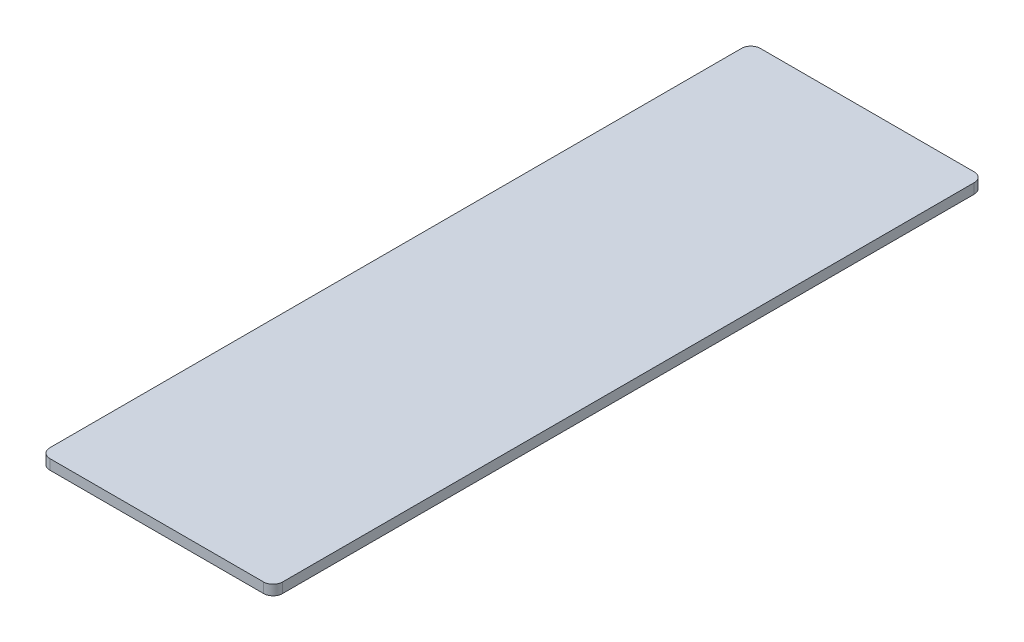
ISO-10303-21;
HEADER;
FILE_DESCRIPTION(('STEP AP214'),'2;1');
FILE_NAME('part.step','',(''),(''),'','','');
FILE_SCHEMA(('AUTOMOTIVE_DESIGN { 1 0 10303 214 1 1 1 1 }'));
ENDSEC;
DATA;
#1=APPLICATION_CONTEXT('core data for automotive mechanical design processes');
#2=APPLICATION_PROTOCOL_DEFINITION('international standard','automotive_design',2000,#1);
#3=PRODUCT_CONTEXT('',#1,'mechanical');
#4=PRODUCT('Part','Part','',(#3));
#5=PRODUCT_RELATED_PRODUCT_CATEGORY('part','',(#4));
#6=PRODUCT_DEFINITION_FORMATION('','',#4);
#7=PRODUCT_DEFINITION_CONTEXT('part definition',#1,'design');
#8=PRODUCT_DEFINITION('design','',#6,#7);
#9=PRODUCT_DEFINITION_SHAPE('','',#8);
#10=(LENGTH_UNIT() NAMED_UNIT(*) SI_UNIT(.MILLI.,.METRE.));
#11=(NAMED_UNIT(*) PLANE_ANGLE_UNIT() SI_UNIT($,.RADIAN.));
#12=(NAMED_UNIT(*) SI_UNIT($,.STERADIAN.) SOLID_ANGLE_UNIT());
#13=UNCERTAINTY_MEASURE_WITH_UNIT(LENGTH_MEASURE(1.E-05),#10,'distance_accuracy_value','');
#14=(GEOMETRIC_REPRESENTATION_CONTEXT(3) GLOBAL_UNCERTAINTY_ASSIGNED_CONTEXT((#13)) GLOBAL_UNIT_ASSIGNED_CONTEXT((#10,
#11,#12)) REPRESENTATION_CONTEXT('',''));
#15=CARTESIAN_POINT('',(0.,0.,0.));
#16=DIRECTION('',(0.,0.,1.));
#17=DIRECTION('',(1.,0.,0.));
#18=AXIS2_PLACEMENT_3D('',#15,#16,#17);
#19=CARTESIAN_POINT('',(25.2806257218328,1.6,113.));
#20=DIRECTION('',(1.,0.,0.));
#21=DIRECTION('',(0.,0.,-1.));
#22=AXIS2_PLACEMENT_3D('',#19,#20,#21);
#23=PLANE('',#22);
#24=DIRECTION('',(0.,0.,1.));
#25=VECTOR('',#24,1.);
#26=CARTESIAN_POINT('',(25.2806257218328,1.6,113.));
#27=LINE('',#26,#25);
#28=CARTESIAN_POINT('',(25.2806257218328,1.6,1.5));
#29=VERTEX_POINT('',#28);
#30=CARTESIAN_POINT('',(25.2806257218328,1.6,111.5));
#31=VERTEX_POINT('',#30);
#32=EDGE_CURVE('E129',#29,#31,#27,.T.);
#33=ORIENTED_EDGE('',*,*,#32,.F.);
#34=DIRECTION('',(0.,-1.,0.));
#35=VECTOR('',#34,1.);
#36=CARTESIAN_POINT('',(25.2806257218328,1.6,1.5));
#37=LINE('',#36,#35);
#38=CARTESIAN_POINT('',(25.2806257218328,0.,1.5));
#39=VERTEX_POINT('',#38);
#40=EDGE_CURVE('E11',#29,#39,#37,.T.);
#41=ORIENTED_EDGE('',*,*,#40,.T.);
#42=DIRECTION('',(0.,0.,1.));
#43=VECTOR('',#42,1.);
#44=CARTESIAN_POINT('',(25.2806257218328,0.,113.));
#45=LINE('',#44,#43);
#46=CARTESIAN_POINT('',(25.2806257218328,0.,111.5));
#47=VERTEX_POINT('',#46);
#48=EDGE_CURVE('E160',#39,#47,#45,.T.);
#49=ORIENTED_EDGE('',*,*,#48,.T.);
#50=DIRECTION('',(0.,-1.,0.));
#51=VECTOR('',#50,1.);
#52=CARTESIAN_POINT('',(25.2806257218328,1.6,111.5));
#53=LINE('',#52,#51);
#54=EDGE_CURVE('E43',#47,#31,#53,.F.);
#55=ORIENTED_EDGE('',*,*,#54,.T.);
#56=EDGE_LOOP('',(#33,#41,#49,#55));
#57=FACE_BOUND('',#56,.T.);
#58=ADVANCED_FACE('F35',(#57),#23,.F.);
#59=CARTESIAN_POINT('',(62.2806257218328,1.6,113.));
#60=DIRECTION('',(0.,0.,-1.));
#61=DIRECTION('',(-1.,0.,0.));
#62=AXIS2_PLACEMENT_3D('',#59,#60,#61);
#63=PLANE('',#62);
#64=DIRECTION('',(1.,0.,0.));
#65=VECTOR('',#64,1.);
#66=CARTESIAN_POINT('',(62.2806257218328,0.,113.));
#67=LINE('',#66,#65);
#68=CARTESIAN_POINT('',(26.7806257218328,0.,113.));
#69=VERTEX_POINT('',#68);
#70=CARTESIAN_POINT('',(60.7806257218328,0.,113.));
#71=VERTEX_POINT('',#70);
#72=EDGE_CURVE('E134',#69,#71,#67,.T.);
#73=ORIENTED_EDGE('',*,*,#72,.T.);
#74=DIRECTION('',(0.,-1.,0.));
#75=VECTOR('',#74,1.);
#76=CARTESIAN_POINT('',(60.7806257218328,1.6,113.));
#77=LINE('',#76,#75);
#78=CARTESIAN_POINT('',(60.7806257218328,1.6,113.));
#79=VERTEX_POINT('',#78);
#80=EDGE_CURVE('E50',#71,#79,#77,.F.);
#81=ORIENTED_EDGE('',*,*,#80,.T.);
#82=DIRECTION('',(1.,0.,0.));
#83=VECTOR('',#82,1.);
#84=CARTESIAN_POINT('',(62.2806257218328,1.6,113.));
#85=LINE('',#84,#83);
#86=CARTESIAN_POINT('',(26.7806257218328,1.6,113.));
#87=VERTEX_POINT('',#86);
#88=EDGE_CURVE('E132',#87,#79,#85,.T.);
#89=ORIENTED_EDGE('',*,*,#88,.F.);
#90=DIRECTION('',(0.,-1.,0.));
#91=VECTOR('',#90,1.);
#92=CARTESIAN_POINT('',(26.7806257218328,1.6,113.));
#93=LINE('',#92,#91);
#94=EDGE_CURVE('E152',#87,#69,#93,.T.);
#95=ORIENTED_EDGE('',*,*,#94,.T.);
#96=EDGE_LOOP('',(#73,#81,#89,#95));
#97=FACE_BOUND('',#96,.T.);
#98=ADVANCED_FACE('F167',(#97),#63,.F.);
#99=CARTESIAN_POINT('',(62.2806257218328,1.6,0.));
#100=DIRECTION('',(-1.,0.,0.));
#101=DIRECTION('',(0.,0.,1.));
#102=AXIS2_PLACEMENT_3D('',#99,#100,#101);
#103=PLANE('',#102);
#104=DIRECTION('',(0.,0.,-1.));
#105=VECTOR('',#104,1.);
#106=CARTESIAN_POINT('',(62.2806257218328,0.,0.));
#107=LINE('',#106,#105);
#108=CARTESIAN_POINT('',(62.2806257218328,0.,111.5));
#109=VERTEX_POINT('',#108);
#110=CARTESIAN_POINT('',(62.2806257218328,0.,1.5));
#111=VERTEX_POINT('',#110);
#112=EDGE_CURVE('E130',#109,#111,#107,.T.);
#113=ORIENTED_EDGE('',*,*,#112,.T.);
#114=DIRECTION('',(0.,-1.,0.));
#115=VECTOR('',#114,1.);
#116=CARTESIAN_POINT('',(62.2806257218328,1.6,1.5));
#117=LINE('',#116,#115);
#118=CARTESIAN_POINT('',(62.2806257218328,1.6,1.5));
#119=VERTEX_POINT('',#118);
#120=EDGE_CURVE('E107',#111,#119,#117,.F.);
#121=ORIENTED_EDGE('',*,*,#120,.T.);
#122=DIRECTION('',(0.,0.,-1.));
#123=VECTOR('',#122,1.);
#124=CARTESIAN_POINT('',(62.2806257218328,1.6,0.));
#125=LINE('',#124,#123);
#126=CARTESIAN_POINT('',(62.2806257218328,1.6,111.5));
#127=VERTEX_POINT('',#126);
#128=EDGE_CURVE('E171',#127,#119,#125,.T.);
#129=ORIENTED_EDGE('',*,*,#128,.F.);
#130=DIRECTION('',(0.,-1.,0.));
#131=VECTOR('',#130,1.);
#132=CARTESIAN_POINT('',(62.2806257218328,1.6,111.5));
#133=LINE('',#132,#131);
#134=EDGE_CURVE('E112',#127,#109,#133,.T.);
#135=ORIENTED_EDGE('',*,*,#134,.T.);
#136=EDGE_LOOP('',(#113,#121,#129,#135));
#137=FACE_BOUND('',#136,.T.);
#138=ADVANCED_FACE('F179',(#137),#103,.F.);
#139=CARTESIAN_POINT('',(25.2806257218328,1.6,0.));
#140=DIRECTION('',(0.,0.,1.));
#141=DIRECTION('',(1.,0.,0.));
#142=AXIS2_PLACEMENT_3D('',#139,#140,#141);
#143=PLANE('',#142);
#144=DIRECTION('',(-1.,0.,0.));
#145=VECTOR('',#144,1.);
#146=CARTESIAN_POINT('',(25.2806257218328,1.6,0.));
#147=LINE('',#146,#145);
#148=CARTESIAN_POINT('',(60.7806257218328,1.6,0.));
#149=VERTEX_POINT('',#148);
#150=CARTESIAN_POINT('',(26.7806257218328,1.6,0.));
#151=VERTEX_POINT('',#150);
#152=EDGE_CURVE('E122',#149,#151,#147,.T.);
#153=ORIENTED_EDGE('',*,*,#152,.F.);
#154=DIRECTION('',(0.,-1.,0.));
#155=VECTOR('',#154,1.);
#156=CARTESIAN_POINT('',(60.7806257218328,1.6,0.));
#157=LINE('',#156,#155);
#158=CARTESIAN_POINT('',(60.7806257218328,0.,0.));
#159=VERTEX_POINT('',#158);
#160=EDGE_CURVE('E106',#149,#159,#157,.T.);
#161=ORIENTED_EDGE('',*,*,#160,.T.);
#162=DIRECTION('',(-1.,0.,0.));
#163=VECTOR('',#162,1.);
#164=CARTESIAN_POINT('',(25.2806257218328,0.,0.));
#165=LINE('',#164,#163);
#166=CARTESIAN_POINT('',(26.7806257218328,0.,0.));
#167=VERTEX_POINT('',#166);
#168=EDGE_CURVE('E119',#159,#167,#165,.T.);
#169=ORIENTED_EDGE('',*,*,#168,.T.);
#170=DIRECTION('',(0.,-1.,0.));
#171=VECTOR('',#170,1.);
#172=CARTESIAN_POINT('',(26.7806257218328,1.6,0.));
#173=LINE('',#172,#171);
#174=EDGE_CURVE('E124',#167,#151,#173,.F.);
#175=ORIENTED_EDGE('',*,*,#174,.T.);
#176=EDGE_LOOP('',(#153,#161,#169,#175));
#177=FACE_BOUND('',#176,.T.);
#178=ADVANCED_FACE('F118',(#177),#143,.F.);
#179=CARTESIAN_POINT('',(0.,1.6,0.));
#180=DIRECTION('',(0.,-1.,0.));
#181=DIRECTION('',(0.,0.,-1.));
#182=AXIS2_PLACEMENT_3D('',#179,#180,#181);
#183=PLANE('',#182);
#184=ORIENTED_EDGE('',*,*,#128,.T.);
#185=CARTESIAN_POINT('',(60.7806257218328,1.6,1.5));
#186=DIRECTION('',(0.,-1.,0.));
#187=DIRECTION('',(0.,0.,-1.));
#188=AXIS2_PLACEMENT_3D('',#185,#186,#187);
#189=CIRCLE('',#188,1.5);
#190=EDGE_CURVE('E150',#119,#149,#189,.F.);
#191=ORIENTED_EDGE('',*,*,#190,.T.);
#192=ORIENTED_EDGE('',*,*,#152,.T.);
#193=CARTESIAN_POINT('',(26.7806257218328,1.6,1.5));
#194=DIRECTION('',(0.,-1.,0.));
#195=DIRECTION('',(0.,0.,-1.));
#196=AXIS2_PLACEMENT_3D('',#193,#194,#195);
#197=CIRCLE('',#196,1.5);
#198=EDGE_CURVE('E146',#151,#29,#197,.F.);
#199=ORIENTED_EDGE('',*,*,#198,.T.);
#200=ORIENTED_EDGE('',*,*,#32,.T.);
#201=CARTESIAN_POINT('',(26.7806257218328,1.6,111.5));
#202=DIRECTION('',(0.,-1.,0.));
#203=DIRECTION('',(0.,0.,-1.));
#204=AXIS2_PLACEMENT_3D('',#201,#202,#203);
#205=CIRCLE('',#204,1.5);
#206=EDGE_CURVE('E57',#31,#87,#205,.F.);
#207=ORIENTED_EDGE('',*,*,#206,.T.);
#208=ORIENTED_EDGE('',*,*,#88,.T.);
#209=CARTESIAN_POINT('',(60.7806257218328,1.6,111.5));
#210=DIRECTION('',(0.,-1.,0.));
#211=DIRECTION('',(0.,0.,-1.));
#212=AXIS2_PLACEMENT_3D('',#209,#210,#211);
#213=CIRCLE('',#212,1.5);
#214=EDGE_CURVE('E148',#79,#127,#213,.F.);
#215=ORIENTED_EDGE('',*,*,#214,.T.);
#216=EDGE_LOOP('',(#184,#191,#192,#199,#200,#207,#208,#215));
#217=FACE_BOUND('',#216,.T.);
#218=ADVANCED_FACE('F163',(#217),#183,.F.);
#219=CARTESIAN_POINT('',(0.,0.,0.));
#220=DIRECTION('',(0.,-1.,0.));
#221=DIRECTION('',(0.,0.,-1.));
#222=AXIS2_PLACEMENT_3D('',#219,#220,#221);
#223=PLANE('',#222);
#224=ORIENTED_EDGE('',*,*,#168,.F.);
#225=CARTESIAN_POINT('',(60.7806257218328,0.,1.5));
#226=DIRECTION('',(0.,-1.,0.));
#227=DIRECTION('',(0.,0.,-1.));
#228=AXIS2_PLACEMENT_3D('',#225,#226,#227);
#229=CIRCLE('',#228,1.5);
#230=EDGE_CURVE('E102',#159,#111,#229,.T.);
#231=ORIENTED_EDGE('',*,*,#230,.T.);
#232=ORIENTED_EDGE('',*,*,#112,.F.);
#233=CARTESIAN_POINT('',(60.7806257218328,0.,111.5));
#234=DIRECTION('',(0.,-1.,0.));
#235=DIRECTION('',(0.,0.,-1.));
#236=AXIS2_PLACEMENT_3D('',#233,#234,#235);
#237=CIRCLE('',#236,1.5);
#238=EDGE_CURVE('E113',#109,#71,#237,.T.);
#239=ORIENTED_EDGE('',*,*,#238,.T.);
#240=ORIENTED_EDGE('',*,*,#72,.F.);
#241=CARTESIAN_POINT('',(26.7806257218328,0.,111.5));
#242=DIRECTION('',(0.,-1.,0.));
#243=DIRECTION('',(0.,0.,-1.));
#244=AXIS2_PLACEMENT_3D('',#241,#242,#243);
#245=CIRCLE('',#244,1.5);
#246=EDGE_CURVE('E123',#69,#47,#245,.T.);
#247=ORIENTED_EDGE('',*,*,#246,.T.);
#248=ORIENTED_EDGE('',*,*,#48,.F.);
#249=CARTESIAN_POINT('',(26.7806257218328,0.,1.5));
#250=DIRECTION('',(0.,-1.,0.));
#251=DIRECTION('',(0.,0.,-1.));
#252=AXIS2_PLACEMENT_3D('',#249,#250,#251);
#253=CIRCLE('',#252,1.5);
#254=EDGE_CURVE('E128',#39,#167,#253,.T.);
#255=ORIENTED_EDGE('',*,*,#254,.T.);
#256=EDGE_LOOP('',(#224,#231,#232,#239,#240,#247,#248,#255));
#257=FACE_BOUND('',#256,.T.);
#258=ADVANCED_FACE('F126',(#257),#223,.T.);
#259=CARTESIAN_POINT('',(60.7806257218328,1.6,1.5));
#260=DIRECTION('',(0.,-1.,0.));
#261=DIRECTION('',(0.,0.,-1.));
#262=AXIS2_PLACEMENT_3D('',#259,#260,#261);
#263=CYLINDRICAL_SURFACE('',#262,1.5);
#264=ORIENTED_EDGE('',*,*,#190,.F.);
#265=ORIENTED_EDGE('',*,*,#120,.F.);
#266=ORIENTED_EDGE('',*,*,#230,.F.);
#267=ORIENTED_EDGE('',*,*,#160,.F.);
#268=EDGE_LOOP('',(#264,#265,#266,#267));
#269=FACE_BOUND('',#268,.T.);
#270=ADVANCED_FACE('F105',(#269),#263,.T.);
#271=CARTESIAN_POINT('',(60.7806257218328,1.6,111.5));
#272=DIRECTION('',(0.,-1.,0.));
#273=DIRECTION('',(0.,0.,-1.));
#274=AXIS2_PLACEMENT_3D('',#271,#272,#273);
#275=CYLINDRICAL_SURFACE('',#274,1.5);
#276=ORIENTED_EDGE('',*,*,#214,.F.);
#277=ORIENTED_EDGE('',*,*,#80,.F.);
#278=ORIENTED_EDGE('',*,*,#238,.F.);
#279=ORIENTED_EDGE('',*,*,#134,.F.);
#280=EDGE_LOOP('',(#276,#277,#278,#279));
#281=FACE_BOUND('',#280,.T.);
#282=ADVANCED_FACE('F177',(#281),#275,.T.);
#283=CARTESIAN_POINT('',(26.7806257218328,1.6,1.5));
#284=DIRECTION('',(0.,-1.,0.));
#285=DIRECTION('',(0.,0.,-1.));
#286=AXIS2_PLACEMENT_3D('',#283,#284,#285);
#287=CYLINDRICAL_SURFACE('',#286,1.5);
#288=ORIENTED_EDGE('',*,*,#198,.F.);
#289=ORIENTED_EDGE('',*,*,#174,.F.);
#290=ORIENTED_EDGE('',*,*,#254,.F.);
#291=ORIENTED_EDGE('',*,*,#40,.F.);
#292=EDGE_LOOP('',(#288,#289,#290,#291));
#293=FACE_BOUND('',#292,.T.);
#294=ADVANCED_FACE('F181',(#293),#287,.T.);
#295=CARTESIAN_POINT('',(26.7806257218328,1.6,111.5));
#296=DIRECTION('',(0.,-1.,0.));
#297=DIRECTION('',(0.,0.,-1.));
#298=AXIS2_PLACEMENT_3D('',#295,#296,#297);
#299=CYLINDRICAL_SURFACE('',#298,1.5);
#300=ORIENTED_EDGE('',*,*,#206,.F.);
#301=ORIENTED_EDGE('',*,*,#54,.F.);
#302=ORIENTED_EDGE('',*,*,#246,.F.);
#303=ORIENTED_EDGE('',*,*,#94,.F.);
#304=EDGE_LOOP('',(#300,#301,#302,#303));
#305=FACE_BOUND('',#304,.T.);
#306=ADVANCED_FACE('F37',(#305),#299,.T.);
#307=CLOSED_SHELL('',(#58,#98,#138,#178,#218,#258,#270,#282,#294,#306));
#308=MANIFOLD_SOLID_BREP('B2',#307);
#309=ADVANCED_BREP_SHAPE_REPRESENTATION('',(#18,#308),#14);
#310=SHAPE_DEFINITION_REPRESENTATION(#9,#309);
ENDSEC;
END-ISO-10303-21;
